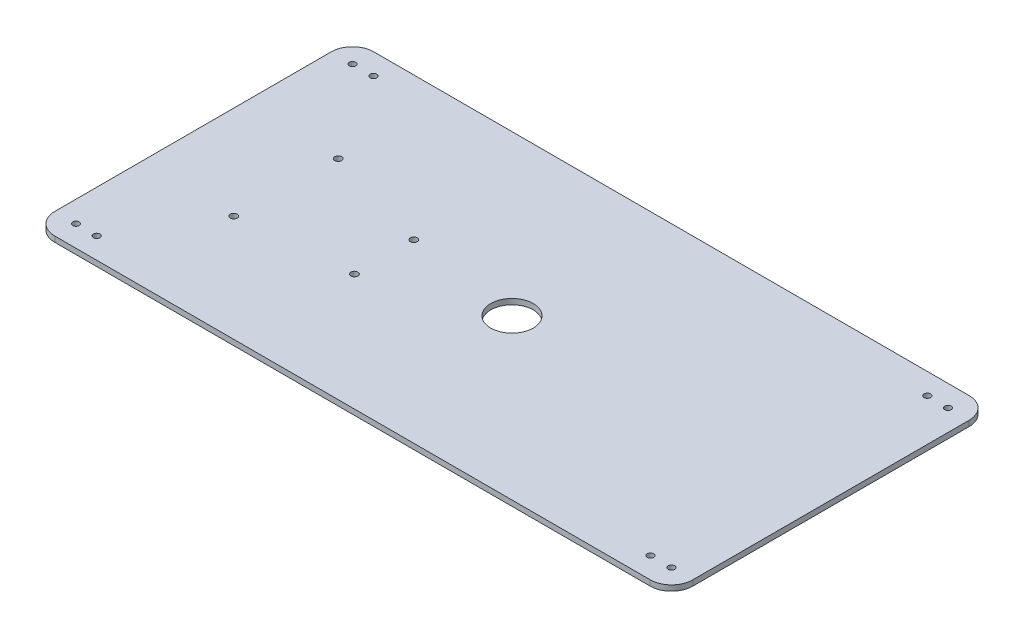
ISO-10303-21;
HEADER;
FILE_DESCRIPTION(('STEP AP214'),'2;1');
FILE_NAME('part.step','',(''),(''),'','','');
FILE_SCHEMA(('AUTOMOTIVE_DESIGN { 1 0 10303 214 1 1 1 1 }'));
ENDSEC;
DATA;
#1=APPLICATION_CONTEXT('core data for automotive mechanical design processes');
#2=APPLICATION_PROTOCOL_DEFINITION('international standard','automotive_design',2000,#1);
#3=PRODUCT_CONTEXT('',#1,'mechanical');
#4=PRODUCT('Part','Part','',(#3));
#5=PRODUCT_RELATED_PRODUCT_CATEGORY('part','',(#4));
#6=PRODUCT_DEFINITION_FORMATION('','',#4);
#7=PRODUCT_DEFINITION_CONTEXT('part definition',#1,'design');
#8=PRODUCT_DEFINITION('design','',#6,#7);
#9=PRODUCT_DEFINITION_SHAPE('','',#8);
#10=(LENGTH_UNIT() NAMED_UNIT(*) SI_UNIT(.MILLI.,.METRE.));
#11=(NAMED_UNIT(*) PLANE_ANGLE_UNIT() SI_UNIT($,.RADIAN.));
#12=(NAMED_UNIT(*) SI_UNIT($,.STERADIAN.) SOLID_ANGLE_UNIT());
#13=UNCERTAINTY_MEASURE_WITH_UNIT(LENGTH_MEASURE(1.E-05),#10,'distance_accuracy_value','');
#14=(GEOMETRIC_REPRESENTATION_CONTEXT(3) GLOBAL_UNCERTAINTY_ASSIGNED_CONTEXT((#13)) GLOBAL_UNIT_ASSIGNED_CONTEXT((#10,
#11,#12)) REPRESENTATION_CONTEXT('',''));
#15=CARTESIAN_POINT('',(0.,0.,0.));
#16=DIRECTION('',(0.,0.,1.));
#17=DIRECTION('',(1.,0.,0.));
#18=AXIS2_PLACEMENT_3D('',#15,#16,#17);
#19=CARTESIAN_POINT('',(0.,2.6,0.));
#20=DIRECTION('',(1.,0.,0.));
#21=DIRECTION('',(0.,0.,-1.));
#22=AXIS2_PLACEMENT_3D('',#19,#20,#21);
#23=PLANE('',#22);
#24=DIRECTION('',(0.,0.,1.));
#25=VECTOR('',#24,1.);
#26=CARTESIAN_POINT('',(0.,2.6,0.));
#27=LINE('',#26,#25);
#28=CARTESIAN_POINT('',(0.,2.6,10.));
#29=VERTEX_POINT('',#28);
#30=CARTESIAN_POINT('',(0.,2.6,140.));
#31=VERTEX_POINT('',#30);
#32=EDGE_CURVE('E121',#29,#31,#27,.T.);
#33=ORIENTED_EDGE('',*,*,#32,.F.);
#34=DIRECTION('',(0.,-1.,0.));
#35=VECTOR('',#34,1.);
#36=CARTESIAN_POINT('',(0.,0.,10.));
#37=LINE('',#36,#35);
#38=CARTESIAN_POINT('',(0.,0.,10.));
#39=VERTEX_POINT('',#38);
#40=EDGE_CURVE('E106',#29,#39,#37,.T.);
#41=ORIENTED_EDGE('',*,*,#40,.T.);
#42=DIRECTION('',(0.,0.,1.));
#43=VECTOR('',#42,1.);
#44=CARTESIAN_POINT('',(0.,0.,0.));
#45=LINE('',#44,#43);
#46=CARTESIAN_POINT('',(0.,0.,140.));
#47=VERTEX_POINT('',#46);
#48=EDGE_CURVE('E118',#39,#47,#45,.T.);
#49=ORIENTED_EDGE('',*,*,#48,.T.);
#50=DIRECTION('',(0.,-1.,0.));
#51=VECTOR('',#50,1.);
#52=CARTESIAN_POINT('',(0.,2.6,140.));
#53=LINE('',#52,#51);
#54=EDGE_CURVE('E123',#47,#31,#53,.F.);
#55=ORIENTED_EDGE('',*,*,#54,.T.);
#56=EDGE_LOOP('',(#33,#41,#49,#55));
#57=FACE_BOUND('',#56,.T.);
#58=ADVANCED_FACE('F35',(#57),#23,.F.);
#59=CARTESIAN_POINT('',(0.,2.6,150.));
#60=DIRECTION('',(0.,0.,-1.));
#61=DIRECTION('',(-1.,0.,0.));
#62=AXIS2_PLACEMENT_3D('',#59,#60,#61);
#63=PLANE('',#62);
#64=DIRECTION('',(1.,0.,0.));
#65=VECTOR('',#64,1.);
#66=CARTESIAN_POINT('',(0.,2.6,150.));
#67=LINE('',#66,#65);
#68=CARTESIAN_POINT('',(10.,2.6,150.));
#69=VERTEX_POINT('',#68);
#70=CARTESIAN_POINT('',(290.,2.6,150.));
#71=VERTEX_POINT('',#70);
#72=EDGE_CURVE('E169',#69,#71,#67,.T.);
#73=ORIENTED_EDGE('',*,*,#72,.F.);
#74=DIRECTION('',(0.,-1.,0.));
#75=VECTOR('',#74,1.);
#76=CARTESIAN_POINT('',(10.,2.6,150.));
#77=LINE('',#76,#75);
#78=CARTESIAN_POINT('',(10.,0.,150.));
#79=VERTEX_POINT('',#78);
#80=EDGE_CURVE('E161',#69,#79,#77,.T.);
#81=ORIENTED_EDGE('',*,*,#80,.T.);
#82=DIRECTION('',(1.,0.,0.));
#83=VECTOR('',#82,1.);
#84=CARTESIAN_POINT('',(0.,0.,150.));
#85=LINE('',#84,#83);
#86=CARTESIAN_POINT('',(290.,0.,150.));
#87=VERTEX_POINT('',#86);
#88=EDGE_CURVE('E127',#79,#87,#85,.T.);
#89=ORIENTED_EDGE('',*,*,#88,.T.);
#90=DIRECTION('',(0.,-1.,0.));
#91=VECTOR('',#90,1.);
#92=CARTESIAN_POINT('',(290.,2.6,150.));
#93=LINE('',#92,#91);
#94=EDGE_CURVE('E159',#87,#71,#93,.F.);
#95=ORIENTED_EDGE('',*,*,#94,.T.);
#96=EDGE_LOOP('',(#73,#81,#89,#95));
#97=FACE_BOUND('',#96,.T.);
#98=ADVANCED_FACE('F167',(#97),#63,.F.);
#99=CARTESIAN_POINT('',(300.,2.6,0.));
#100=DIRECTION('',(1.,0.,0.));
#101=DIRECTION('',(0.,0.,-1.));
#102=AXIS2_PLACEMENT_3D('',#99,#100,#101);
#103=PLANE('',#102);
#104=DIRECTION('',(0.,0.,1.));
#105=VECTOR('',#104,1.);
#106=CARTESIAN_POINT('',(300.,2.6,0.));
#107=LINE('',#106,#105);
#108=CARTESIAN_POINT('',(300.,2.6,10.));
#109=VERTEX_POINT('',#108);
#110=CARTESIAN_POINT('',(300.,2.6,140.));
#111=VERTEX_POINT('',#110);
#112=EDGE_CURVE('E176',#109,#111,#107,.T.);
#113=ORIENTED_EDGE('',*,*,#112,.T.);
#114=DIRECTION('',(0.,-1.,0.));
#115=VECTOR('',#114,1.);
#116=CARTESIAN_POINT('',(300.,0.,140.));
#117=LINE('',#116,#115);
#118=CARTESIAN_POINT('',(300.,0.,140.));
#119=VERTEX_POINT('',#118);
#120=EDGE_CURVE('E11',#111,#119,#117,.T.);
#121=ORIENTED_EDGE('',*,*,#120,.T.);
#122=DIRECTION('',(0.,0.,1.));
#123=VECTOR('',#122,1.);
#124=CARTESIAN_POINT('',(300.,0.,0.));
#125=LINE('',#124,#123);
#126=CARTESIAN_POINT('',(300.,0.,10.));
#127=VERTEX_POINT('',#126);
#128=EDGE_CURVE('E131',#127,#119,#125,.T.);
#129=ORIENTED_EDGE('',*,*,#128,.F.);
#130=DIRECTION('',(0.,-1.,0.));
#131=VECTOR('',#130,1.);
#132=CARTESIAN_POINT('',(300.,2.6,10.));
#133=LINE('',#132,#131);
#134=EDGE_CURVE('E44',#127,#109,#133,.F.);
#135=ORIENTED_EDGE('',*,*,#134,.T.);
#136=EDGE_LOOP('',(#113,#121,#129,#135));
#137=FACE_BOUND('',#136,.T.);
#138=ADVANCED_FACE('F175',(#137),#103,.T.);
#139=CARTESIAN_POINT('',(0.,2.6,0.));
#140=DIRECTION('',(0.,0.,-1.));
#141=DIRECTION('',(-1.,0.,0.));
#142=AXIS2_PLACEMENT_3D('',#139,#140,#141);
#143=PLANE('',#142);
#144=DIRECTION('',(1.,0.,0.));
#145=VECTOR('',#144,1.);
#146=CARTESIAN_POINT('',(0.,0.,0.));
#147=LINE('',#146,#145);
#148=CARTESIAN_POINT('',(10.,0.,0.));
#149=VERTEX_POINT('',#148);
#150=CARTESIAN_POINT('',(290.,0.,0.));
#151=VERTEX_POINT('',#150);
#152=EDGE_CURVE('E142',#149,#151,#147,.T.);
#153=ORIENTED_EDGE('',*,*,#152,.F.);
#154=DIRECTION('',(0.,-1.,0.));
#155=VECTOR('',#154,1.);
#156=CARTESIAN_POINT('',(10.,2.6,0.));
#157=LINE('',#156,#155);
#158=CARTESIAN_POINT('',(10.,2.6,0.));
#159=VERTEX_POINT('',#158);
#160=EDGE_CURVE('E107',#149,#159,#157,.F.);
#161=ORIENTED_EDGE('',*,*,#160,.T.);
#162=DIRECTION('',(1.,0.,0.));
#163=VECTOR('',#162,1.);
#164=CARTESIAN_POINT('',(0.,2.6,0.));
#165=LINE('',#164,#163);
#166=CARTESIAN_POINT('',(290.,2.6,0.));
#167=VERTEX_POINT('',#166);
#168=EDGE_CURVE('E137',#159,#167,#165,.T.);
#169=ORIENTED_EDGE('',*,*,#168,.T.);
#170=DIRECTION('',(0.,-1.,0.));
#171=VECTOR('',#170,1.);
#172=CARTESIAN_POINT('',(290.,2.6,0.));
#173=LINE('',#172,#171);
#174=EDGE_CURVE('E112',#167,#151,#173,.T.);
#175=ORIENTED_EDGE('',*,*,#174,.T.);
#176=EDGE_LOOP('',(#153,#161,#169,#175));
#177=FACE_BOUND('',#176,.T.);
#178=ADVANCED_FACE('F433',(#177),#143,.T.);
#179=CARTESIAN_POINT('',(0.,2.6,0.));
#180=DIRECTION('',(0.,1.,0.));
#181=DIRECTION('',(0.,0.,1.));
#182=AXIS2_PLACEMENT_3D('',#179,#180,#181);
#183=PLANE('',#182);
#184=CARTESIAN_POINT('',(19.812,2.6,140.094));
#185=DIRECTION('',(0.,-1.,0.));
#186=DIRECTION('',(0.,0.,-1.));
#187=AXIS2_PLACEMENT_3D('',#184,#185,#186);
#188=CIRCLE('',#187,1.524);
#189=CARTESIAN_POINT('',(19.812,2.6,138.57));
#190=VERTEX_POINT('',#189);
#191=EDGE_CURVE('E248',#190,#190,#188,.T.);
#192=ORIENTED_EDGE('',*,*,#191,.T.);
#193=EDGE_LOOP('',(#192));
#194=FACE_BOUND('',#193,.T.);
#195=CARTESIAN_POINT('',(280.188,2.6,140.094));
#196=DIRECTION('',(0.,1.,0.));
#197=DIRECTION('',(0.,0.,-1.));
#198=AXIS2_PLACEMENT_3D('',#195,#196,#197);
#199=CIRCLE('',#198,1.524);
#200=CARTESIAN_POINT('',(280.188,2.6,138.57));
#201=VERTEX_POINT('',#200);
#202=EDGE_CURVE('E242',#201,#201,#199,.T.);
#203=ORIENTED_EDGE('',*,*,#202,.F.);
#204=EDGE_LOOP('',(#203));
#205=FACE_BOUND('',#204,.T.);
#206=CARTESIAN_POINT('',(280.188,2.6,9.90599999999998));
#207=DIRECTION('',(0.,-1.,0.));
#208=DIRECTION('',(0.,0.,1.));
#209=AXIS2_PLACEMENT_3D('',#206,#207,#208);
#210=CIRCLE('',#209,1.524);
#211=CARTESIAN_POINT('',(280.188,2.6,11.43));
#212=VERTEX_POINT('',#211);
#213=EDGE_CURVE('E236',#212,#212,#210,.T.);
#214=ORIENTED_EDGE('',*,*,#213,.T.);
#215=EDGE_LOOP('',(#214));
#216=FACE_BOUND('',#215,.T.);
#217=CARTESIAN_POINT('',(19.812,2.6,9.906));
#218=DIRECTION('',(0.,1.,0.));
#219=DIRECTION('',(0.,0.,1.));
#220=AXIS2_PLACEMENT_3D('',#217,#218,#219);
#221=CIRCLE('',#220,1.524);
#222=CARTESIAN_POINT('',(19.812,2.6,11.43));
#223=VERTEX_POINT('',#222);
#224=EDGE_CURVE('E230',#223,#223,#221,.T.);
#225=ORIENTED_EDGE('',*,*,#224,.F.);
#226=EDGE_LOOP('',(#225));
#227=FACE_BOUND('',#226,.T.);
#228=CARTESIAN_POINT('',(150.,2.6,75.));
#229=DIRECTION('',(0.,-1.,0.));
#230=DIRECTION('',(0.,0.,-1.));
#231=AXIS2_PLACEMENT_3D('',#228,#229,#230);
#232=CIRCLE('',#231,10.);
#233=CARTESIAN_POINT('',(150.,2.6,65.));
#234=VERTEX_POINT('',#233);
#235=EDGE_CURVE('E221',#234,#234,#232,.T.);
#236=ORIENTED_EDGE('',*,*,#235,.T.);
#237=EDGE_LOOP('',(#236));
#238=FACE_BOUND('',#237,.T.);
#239=CARTESIAN_POINT('',(95.94475,2.6,95.03875));
#240=DIRECTION('',(0.,1.,0.));
#241=DIRECTION('',(0.,0.,1.));
#242=AXIS2_PLACEMENT_3D('',#239,#240,#241);
#243=CIRCLE('',#242,1.61925);
#244=CARTESIAN_POINT('',(95.94475,2.6,96.658));
#245=VERTEX_POINT('',#244);
#246=EDGE_CURVE('E218',#245,#245,#243,.T.);
#247=ORIENTED_EDGE('',*,*,#246,.F.);
#248=EDGE_LOOP('',(#247));
#249=FACE_BOUND('',#248,.T.);
#250=CARTESIAN_POINT('',(44.01445,2.6,99.78855));
#251=DIRECTION('',(0.,1.,0.));
#252=DIRECTION('',(0.,0.,1.));
#253=AXIS2_PLACEMENT_3D('',#250,#251,#252);
#254=CIRCLE('',#253,1.61925);
#255=CARTESIAN_POINT('',(44.01445,2.6,101.4078));
#256=VERTEX_POINT('',#255);
#257=EDGE_CURVE('E212',#256,#256,#254,.T.);
#258=ORIENTED_EDGE('',*,*,#257,.F.);
#259=EDGE_LOOP('',(#258));
#260=FACE_BOUND('',#259,.T.);
#261=CARTESIAN_POINT('',(95.94475,2.6,67.11145));
#262=DIRECTION('',(0.,1.,0.));
#263=DIRECTION('',(0.,0.,1.));
#264=AXIS2_PLACEMENT_3D('',#261,#262,#263);
#265=CIRCLE('',#264,1.61925);
#266=CARTESIAN_POINT('',(95.94475,2.6,68.7307));
#267=VERTEX_POINT('',#266);
#268=EDGE_CURVE('E206',#267,#267,#265,.T.);
#269=ORIENTED_EDGE('',*,*,#268,.F.);
#270=EDGE_LOOP('',(#269));
#271=FACE_BOUND('',#270,.T.);
#272=CARTESIAN_POINT('',(45.15745,2.6,51.87145));
#273=DIRECTION('',(0.,1.,0.));
#274=DIRECTION('',(0.,0.,1.));
#275=AXIS2_PLACEMENT_3D('',#272,#273,#274);
#276=CIRCLE('',#275,1.61924999999999);
#277=CARTESIAN_POINT('',(45.15745,2.6,53.4907));
#278=VERTEX_POINT('',#277);
#279=EDGE_CURVE('E202',#278,#278,#276,.T.);
#280=ORIENTED_EDGE('',*,*,#279,.F.);
#281=EDGE_LOOP('',(#280));
#282=FACE_BOUND('',#281,.T.);
#283=CARTESIAN_POINT('',(290.,2.6,140.));
#284=DIRECTION('',(0.,1.,0.));
#285=DIRECTION('',(0.,0.,1.));
#286=AXIS2_PLACEMENT_3D('',#283,#284,#285);
#287=CIRCLE('',#286,1.50000000000002);
#288=CARTESIAN_POINT('',(290.,2.6,141.5));
#289=VERTEX_POINT('',#288);
#290=EDGE_CURVE('E194',#289,#289,#287,.T.);
#291=ORIENTED_EDGE('',*,*,#290,.F.);
#292=EDGE_LOOP('',(#291));
#293=FACE_BOUND('',#292,.T.);
#294=CARTESIAN_POINT('',(10.,2.6,140.));
#295=DIRECTION('',(0.,-1.,0.));
#296=DIRECTION('',(0.,0.,1.));
#297=AXIS2_PLACEMENT_3D('',#294,#295,#296);
#298=CIRCLE('',#297,1.50000000000002);
#299=CARTESIAN_POINT('',(10.,2.6,141.5));
#300=VERTEX_POINT('',#299);
#301=EDGE_CURVE('E188',#300,#300,#298,.T.);
#302=ORIENTED_EDGE('',*,*,#301,.T.);
#303=EDGE_LOOP('',(#302));
#304=FACE_BOUND('',#303,.T.);
#305=CARTESIAN_POINT('',(10.,2.6,10.));
#306=DIRECTION('',(0.,1.,0.));
#307=DIRECTION('',(0.,0.,-1.));
#308=AXIS2_PLACEMENT_3D('',#305,#306,#307);
#309=CIRCLE('',#308,1.50000000000002);
#310=CARTESIAN_POINT('',(10.,2.6,8.49999999999999));
#311=VERTEX_POINT('',#310);
#312=EDGE_CURVE('E183',#311,#311,#309,.T.);
#313=ORIENTED_EDGE('',*,*,#312,.F.);
#314=EDGE_LOOP('',(#313));
#315=FACE_BOUND('',#314,.T.);
#316=CARTESIAN_POINT('',(290.,2.6,10.));
#317=DIRECTION('',(0.,-1.,0.));
#318=DIRECTION('',(0.,0.,-1.));
#319=AXIS2_PLACEMENT_3D('',#316,#317,#318);
#320=CIRCLE('',#319,1.50000000000002);
#321=CARTESIAN_POINT('',(290.,2.6,8.49999999999998));
#322=VERTEX_POINT('',#321);
#323=EDGE_CURVE('E128',#322,#322,#320,.T.);
#324=ORIENTED_EDGE('',*,*,#323,.T.);
#325=EDGE_LOOP('',(#324));
#326=FACE_BOUND('',#325,.T.);
#327=ORIENTED_EDGE('',*,*,#168,.F.);
#328=CARTESIAN_POINT('',(10.,2.6,10.));
#329=DIRECTION('',(0.,1.,0.));
#330=DIRECTION('',(0.,0.,1.));
#331=AXIS2_PLACEMENT_3D('',#328,#329,#330);
#332=CIRCLE('',#331,10.);
#333=EDGE_CURVE('E157',#159,#29,#332,.T.);
#334=ORIENTED_EDGE('',*,*,#333,.T.);
#335=ORIENTED_EDGE('',*,*,#32,.T.);
#336=CARTESIAN_POINT('',(10.,2.6,140.));
#337=DIRECTION('',(0.,1.,0.));
#338=DIRECTION('',(0.,0.,1.));
#339=AXIS2_PLACEMENT_3D('',#336,#337,#338);
#340=CIRCLE('',#339,10.);
#341=EDGE_CURVE('E155',#31,#69,#340,.T.);
#342=ORIENTED_EDGE('',*,*,#341,.T.);
#343=ORIENTED_EDGE('',*,*,#72,.T.);
#344=CARTESIAN_POINT('',(290.,2.6,140.));
#345=DIRECTION('',(0.,1.,0.));
#346=DIRECTION('',(0.,0.,1.));
#347=AXIS2_PLACEMENT_3D('',#344,#345,#346);
#348=CIRCLE('',#347,10.);
#349=EDGE_CURVE('E51',#71,#111,#348,.T.);
#350=ORIENTED_EDGE('',*,*,#349,.T.);
#351=ORIENTED_EDGE('',*,*,#112,.F.);
#352=CARTESIAN_POINT('',(290.,2.6,10.));
#353=DIRECTION('',(0.,1.,0.));
#354=DIRECTION('',(0.,0.,1.));
#355=AXIS2_PLACEMENT_3D('',#352,#353,#354);
#356=CIRCLE('',#355,10.);
#357=EDGE_CURVE('E152',#109,#167,#356,.T.);
#358=ORIENTED_EDGE('',*,*,#357,.T.);
#359=EDGE_LOOP('',(#327,#334,#335,#342,#343,#350,#351,#358));
#360=FACE_BOUND('',#359,.T.);
#361=ADVANCED_FACE('F259',(#194,#205,#216,#227,#238,#249,#260,#271,#282,#293,#304,#315,#326,
#360),#183,.T.);
#362=CARTESIAN_POINT('',(0.,0.,0.));
#363=DIRECTION('',(0.,1.,0.));
#364=DIRECTION('',(0.,0.,1.));
#365=AXIS2_PLACEMENT_3D('',#362,#363,#364);
#366=PLANE('',#365);
#367=CARTESIAN_POINT('',(19.812,1.19999999954185E-07,140.094));
#368=DIRECTION('',(0.,-1.,0.));
#369=DIRECTION('',(0.,0.,-1.));
#370=AXIS2_PLACEMENT_3D('',#367,#368,#369);
#371=CIRCLE('',#370,1.524);
#372=CARTESIAN_POINT('',(19.812,1.19999999954185E-07,138.57));
#373=VERTEX_POINT('',#372);
#374=EDGE_CURVE('E245',#373,#373,#371,.T.);
#375=ORIENTED_EDGE('',*,*,#374,.F.);
#376=EDGE_LOOP('',(#375));
#377=FACE_BOUND('',#376,.T.);
#378=CARTESIAN_POINT('',(280.188,1.19999999954185E-07,140.094));
#379=DIRECTION('',(0.,1.,0.));
#380=DIRECTION('',(0.,0.,-1.));
#381=AXIS2_PLACEMENT_3D('',#378,#379,#380);
#382=CIRCLE('',#381,1.524);
#383=CARTESIAN_POINT('',(280.188,1.19999999954185E-07,138.57));
#384=VERTEX_POINT('',#383);
#385=EDGE_CURVE('E239',#384,#384,#382,.T.);
#386=ORIENTED_EDGE('',*,*,#385,.T.);
#387=EDGE_LOOP('',(#386));
#388=FACE_BOUND('',#387,.T.);
#389=CARTESIAN_POINT('',(280.188,1.19999999954185E-07,9.90599999999998));
#390=DIRECTION('',(0.,-1.,0.));
#391=DIRECTION('',(0.,0.,1.));
#392=AXIS2_PLACEMENT_3D('',#389,#390,#391);
#393=CIRCLE('',#392,1.524);
#394=CARTESIAN_POINT('',(280.188,1.19999999954185E-07,11.43));
#395=VERTEX_POINT('',#394);
#396=EDGE_CURVE('E233',#395,#395,#393,.T.);
#397=ORIENTED_EDGE('',*,*,#396,.F.);
#398=EDGE_LOOP('',(#397));
#399=FACE_BOUND('',#398,.T.);
#400=CARTESIAN_POINT('',(19.812,1.19999999954185E-07,9.906));
#401=DIRECTION('',(0.,1.,0.));
#402=DIRECTION('',(0.,0.,1.));
#403=AXIS2_PLACEMENT_3D('',#400,#401,#402);
#404=CIRCLE('',#403,1.524);
#405=CARTESIAN_POINT('',(19.812,1.19999999954185E-07,11.43));
#406=VERTEX_POINT('',#405);
#407=EDGE_CURVE('E227',#406,#406,#404,.T.);
#408=ORIENTED_EDGE('',*,*,#407,.T.);
#409=EDGE_LOOP('',(#408));
#410=FACE_BOUND('',#409,.T.);
#411=CARTESIAN_POINT('',(150.,0.,75.));
#412=DIRECTION('',(0.,-1.,0.));
#413=DIRECTION('',(0.,0.,-1.));
#414=AXIS2_PLACEMENT_3D('',#411,#412,#413);
#415=CIRCLE('',#414,10.);
#416=CARTESIAN_POINT('',(150.,0.,65.));
#417=VERTEX_POINT('',#416);
#418=EDGE_CURVE('E224',#417,#417,#415,.T.);
#419=ORIENTED_EDGE('',*,*,#418,.F.);
#420=EDGE_LOOP('',(#419));
#421=FACE_BOUND('',#420,.T.);
#422=CARTESIAN_POINT('',(95.94475,0.,95.03875));
#423=DIRECTION('',(0.,1.,0.));
#424=DIRECTION('',(0.,0.,1.));
#425=AXIS2_PLACEMENT_3D('',#422,#423,#424);
#426=CIRCLE('',#425,1.61925);
#427=CARTESIAN_POINT('',(95.94475,0.,96.658));
#428=VERTEX_POINT('',#427);
#429=EDGE_CURVE('E215',#428,#428,#426,.T.);
#430=ORIENTED_EDGE('',*,*,#429,.T.);
#431=EDGE_LOOP('',(#430));
#432=FACE_BOUND('',#431,.T.);
#433=CARTESIAN_POINT('',(44.01445,0.,99.78855));
#434=DIRECTION('',(0.,1.,0.));
#435=DIRECTION('',(0.,0.,1.));
#436=AXIS2_PLACEMENT_3D('',#433,#434,#435);
#437=CIRCLE('',#436,1.61925);
#438=CARTESIAN_POINT('',(44.01445,0.,101.4078));
#439=VERTEX_POINT('',#438);
#440=EDGE_CURVE('E209',#439,#439,#437,.T.);
#441=ORIENTED_EDGE('',*,*,#440,.T.);
#442=EDGE_LOOP('',(#441));
#443=FACE_BOUND('',#442,.T.);
#444=CARTESIAN_POINT('',(95.94475,0.,67.11145));
#445=DIRECTION('',(0.,1.,0.));
#446=DIRECTION('',(0.,0.,1.));
#447=AXIS2_PLACEMENT_3D('',#444,#445,#446);
#448=CIRCLE('',#447,1.61925);
#449=CARTESIAN_POINT('',(95.94475,0.,68.7307));
#450=VERTEX_POINT('',#449);
#451=EDGE_CURVE('E205',#450,#450,#448,.T.);
#452=ORIENTED_EDGE('',*,*,#451,.T.);
#453=EDGE_LOOP('',(#452));
#454=FACE_BOUND('',#453,.T.);
#455=CARTESIAN_POINT('',(45.15745,0.,51.87145));
#456=DIRECTION('',(0.,1.,0.));
#457=DIRECTION('',(0.,0.,1.));
#458=AXIS2_PLACEMENT_3D('',#455,#456,#457);
#459=CIRCLE('',#458,1.61924999999999);
#460=CARTESIAN_POINT('',(45.15745,0.,53.4907));
#461=VERTEX_POINT('',#460);
#462=EDGE_CURVE('E39',#461,#461,#459,.T.);
#463=ORIENTED_EDGE('',*,*,#462,.T.);
#464=EDGE_LOOP('',(#463));
#465=FACE_BOUND('',#464,.T.);
#466=CARTESIAN_POINT('',(290.,0.,140.));
#467=DIRECTION('',(0.,1.,0.));
#468=DIRECTION('',(0.,0.,1.));
#469=AXIS2_PLACEMENT_3D('',#466,#467,#468);
#470=CIRCLE('',#469,1.50000000000002);
#471=CARTESIAN_POINT('',(290.,0.,141.5));
#472=VERTEX_POINT('',#471);
#473=EDGE_CURVE('E197',#472,#472,#470,.T.);
#474=ORIENTED_EDGE('',*,*,#473,.T.);
#475=EDGE_LOOP('',(#474));
#476=FACE_BOUND('',#475,.T.);
#477=CARTESIAN_POINT('',(10.,0.,140.));
#478=DIRECTION('',(0.,-1.,0.));
#479=DIRECTION('',(0.,0.,1.));
#480=AXIS2_PLACEMENT_3D('',#477,#478,#479);
#481=CIRCLE('',#480,1.50000000000002);
#482=CARTESIAN_POINT('',(10.,0.,141.5));
#483=VERTEX_POINT('',#482);
#484=EDGE_CURVE('E191',#483,#483,#481,.T.);
#485=ORIENTED_EDGE('',*,*,#484,.F.);
#486=EDGE_LOOP('',(#485));
#487=FACE_BOUND('',#486,.T.);
#488=CARTESIAN_POINT('',(10.,0.,10.));
#489=DIRECTION('',(0.,1.,0.));
#490=DIRECTION('',(0.,0.,-1.));
#491=AXIS2_PLACEMENT_3D('',#488,#489,#490);
#492=CIRCLE('',#491,1.50000000000002);
#493=CARTESIAN_POINT('',(10.,0.,8.49999999999999));
#494=VERTEX_POINT('',#493);
#495=EDGE_CURVE('E185',#494,#494,#492,.T.);
#496=ORIENTED_EDGE('',*,*,#495,.T.);
#497=EDGE_LOOP('',(#496));
#498=FACE_BOUND('',#497,.T.);
#499=CARTESIAN_POINT('',(290.,0.,10.));
#500=DIRECTION('',(0.,-1.,0.));
#501=DIRECTION('',(0.,0.,-1.));
#502=AXIS2_PLACEMENT_3D('',#499,#500,#501);
#503=CIRCLE('',#502,1.50000000000002);
#504=CARTESIAN_POINT('',(290.,0.,8.49999999999998));
#505=VERTEX_POINT('',#504);
#506=EDGE_CURVE('E134',#505,#505,#503,.T.);
#507=ORIENTED_EDGE('',*,*,#506,.F.);
#508=EDGE_LOOP('',(#507));
#509=FACE_BOUND('',#508,.T.);
#510=ORIENTED_EDGE('',*,*,#48,.F.);
#511=CARTESIAN_POINT('',(10.,0.,10.));
#512=DIRECTION('',(0.,1.,0.));
#513=DIRECTION('',(0.,0.,1.));
#514=AXIS2_PLACEMENT_3D('',#511,#512,#513);
#515=CIRCLE('',#514,10.);
#516=EDGE_CURVE('E102',#39,#149,#515,.F.);
#517=ORIENTED_EDGE('',*,*,#516,.T.);
#518=ORIENTED_EDGE('',*,*,#152,.T.);
#519=CARTESIAN_POINT('',(290.,0.,10.));
#520=DIRECTION('',(0.,1.,0.));
#521=DIRECTION('',(0.,0.,1.));
#522=AXIS2_PLACEMENT_3D('',#519,#520,#521);
#523=CIRCLE('',#522,10.);
#524=EDGE_CURVE('E122',#151,#127,#523,.F.);
#525=ORIENTED_EDGE('',*,*,#524,.T.);
#526=ORIENTED_EDGE('',*,*,#128,.T.);
#527=CARTESIAN_POINT('',(290.,0.,140.));
#528=DIRECTION('',(0.,1.,0.));
#529=DIRECTION('',(0.,0.,1.));
#530=AXIS2_PLACEMENT_3D('',#527,#528,#529);
#531=CIRCLE('',#530,10.);
#532=EDGE_CURVE('E146',#119,#87,#531,.F.);
#533=ORIENTED_EDGE('',*,*,#532,.T.);
#534=ORIENTED_EDGE('',*,*,#88,.F.);
#535=CARTESIAN_POINT('',(10.,0.,140.));
#536=DIRECTION('',(0.,1.,0.));
#537=DIRECTION('',(0.,0.,1.));
#538=AXIS2_PLACEMENT_3D('',#535,#536,#537);
#539=CIRCLE('',#538,10.);
#540=EDGE_CURVE('E113',#79,#47,#539,.F.);
#541=ORIENTED_EDGE('',*,*,#540,.T.);
#542=EDGE_LOOP('',(#510,#517,#518,#525,#526,#533,#534,#541));
#543=FACE_BOUND('',#542,.T.);
#544=ADVANCED_FACE('F125',(#377,#388,#399,#410,#421,#432,#443,#454,#465,#476,#487,#498,#509,
#543),#366,.F.);
#545=CARTESIAN_POINT('',(10.,2.6,10.));
#546=DIRECTION('',(0.,1.,0.));
#547=DIRECTION('',(0.,0.,1.));
#548=AXIS2_PLACEMENT_3D('',#545,#546,#547);
#549=CYLINDRICAL_SURFACE('',#548,10.);
#550=ORIENTED_EDGE('',*,*,#333,.F.);
#551=ORIENTED_EDGE('',*,*,#160,.F.);
#552=ORIENTED_EDGE('',*,*,#516,.F.);
#553=ORIENTED_EDGE('',*,*,#40,.F.);
#554=EDGE_LOOP('',(#550,#551,#552,#553));
#555=FACE_BOUND('',#554,.T.);
#556=ADVANCED_FACE('F105',(#555),#549,.T.);
#557=CARTESIAN_POINT('',(10.,2.6,140.));
#558=DIRECTION('',(0.,-1.,0.));
#559=DIRECTION('',(0.,0.,-1.));
#560=AXIS2_PLACEMENT_3D('',#557,#558,#559);
#561=CYLINDRICAL_SURFACE('',#560,10.);
#562=ORIENTED_EDGE('',*,*,#341,.F.);
#563=ORIENTED_EDGE('',*,*,#54,.F.);
#564=ORIENTED_EDGE('',*,*,#540,.F.);
#565=ORIENTED_EDGE('',*,*,#80,.F.);
#566=EDGE_LOOP('',(#562,#563,#564,#565));
#567=FACE_BOUND('',#566,.T.);
#568=ADVANCED_FACE('F311',(#567),#561,.T.);
#569=CARTESIAN_POINT('',(290.,2.6,140.));
#570=DIRECTION('',(0.,1.,0.));
#571=DIRECTION('',(0.,0.,1.));
#572=AXIS2_PLACEMENT_3D('',#569,#570,#571);
#573=CYLINDRICAL_SURFACE('',#572,10.);
#574=ORIENTED_EDGE('',*,*,#349,.F.);
#575=ORIENTED_EDGE('',*,*,#94,.F.);
#576=ORIENTED_EDGE('',*,*,#532,.F.);
#577=ORIENTED_EDGE('',*,*,#120,.F.);
#578=EDGE_LOOP('',(#574,#575,#576,#577));
#579=FACE_BOUND('',#578,.T.);
#580=ADVANCED_FACE('F174',(#579),#573,.T.);
#581=CARTESIAN_POINT('',(290.,2.6,10.));
#582=DIRECTION('',(0.,-1.,0.));
#583=DIRECTION('',(0.,0.,-1.));
#584=AXIS2_PLACEMENT_3D('',#581,#582,#583);
#585=CYLINDRICAL_SURFACE('',#584,10.);
#586=ORIENTED_EDGE('',*,*,#357,.F.);
#587=ORIENTED_EDGE('',*,*,#134,.F.);
#588=ORIENTED_EDGE('',*,*,#524,.F.);
#589=ORIENTED_EDGE('',*,*,#174,.F.);
#590=EDGE_LOOP('',(#586,#587,#588,#589));
#591=FACE_BOUND('',#590,.T.);
#592=ADVANCED_FACE('F37',(#591),#585,.T.);
#593=CARTESIAN_POINT('',(290.,2.6,10.));
#594=DIRECTION('',(0.,-1.,0.));
#595=DIRECTION('',(0.,0.,-1.));
#596=AXIS2_PLACEMENT_3D('',#593,#594,#595);
#597=CYLINDRICAL_SURFACE('',#596,1.50000000000002);
#598=ORIENTED_EDGE('',*,*,#323,.F.);
#599=EDGE_LOOP('',(#598));
#600=FACE_BOUND('',#599,.T.);
#601=ORIENTED_EDGE('',*,*,#506,.T.);
#602=EDGE_LOOP('',(#601));
#603=FACE_BOUND('',#602,.T.);
#604=ADVANCED_FACE('F286',(#600,#603),#597,.F.);
#605=CARTESIAN_POINT('',(10.,2.6,10.));
#606=DIRECTION('',(0.,-1.,0.));
#607=DIRECTION('',(0.,0.,-1.));
#608=AXIS2_PLACEMENT_3D('',#605,#606,#607);
#609=CYLINDRICAL_SURFACE('',#608,1.50000000000002);
#610=ORIENTED_EDGE('',*,*,#312,.T.);
#611=EDGE_LOOP('',(#610));
#612=FACE_BOUND('',#611,.T.);
#613=ORIENTED_EDGE('',*,*,#495,.F.);
#614=EDGE_LOOP('',(#613));
#615=FACE_BOUND('',#614,.T.);
#616=ADVANCED_FACE('F288',(#612,#615),#609,.F.);
#617=CARTESIAN_POINT('',(10.,2.6,140.));
#618=DIRECTION('',(0.,-1.,0.));
#619=DIRECTION('',(0.,0.,-1.));
#620=AXIS2_PLACEMENT_3D('',#617,#618,#619);
#621=CYLINDRICAL_SURFACE('',#620,1.50000000000002);
#622=ORIENTED_EDGE('',*,*,#301,.F.);
#623=EDGE_LOOP('',(#622));
#624=FACE_BOUND('',#623,.T.);
#625=ORIENTED_EDGE('',*,*,#484,.T.);
#626=EDGE_LOOP('',(#625));
#627=FACE_BOUND('',#626,.T.);
#628=ADVANCED_FACE('F295',(#624,#627),#621,.F.);
#629=CARTESIAN_POINT('',(290.,2.6,140.));
#630=DIRECTION('',(0.,-1.,0.));
#631=DIRECTION('',(0.,0.,-1.));
#632=AXIS2_PLACEMENT_3D('',#629,#630,#631);
#633=CYLINDRICAL_SURFACE('',#632,1.50000000000002);
#634=ORIENTED_EDGE('',*,*,#290,.T.);
#635=EDGE_LOOP('',(#634));
#636=FACE_BOUND('',#635,.T.);
#637=ORIENTED_EDGE('',*,*,#473,.F.);
#638=EDGE_LOOP('',(#637));
#639=FACE_BOUND('',#638,.T.);
#640=ADVANCED_FACE('F341',(#636,#639),#633,.F.);
#641=CARTESIAN_POINT('',(45.15745,-7.4,51.87145));
#642=DIRECTION('',(0.,1.,0.));
#643=DIRECTION('',(0.,0.,1.));
#644=AXIS2_PLACEMENT_3D('',#641,#642,#643);
#645=CYLINDRICAL_SURFACE('',#644,1.61924999999999);
#646=ORIENTED_EDGE('',*,*,#279,.T.);
#647=EDGE_LOOP('',(#646));
#648=FACE_BOUND('',#647,.T.);
#649=ORIENTED_EDGE('',*,*,#462,.F.);
#650=EDGE_LOOP('',(#649));
#651=FACE_BOUND('',#650,.T.);
#652=ADVANCED_FACE('F351',(#648,#651),#645,.F.);
#653=CARTESIAN_POINT('',(95.94475,0.,67.11145));
#654=DIRECTION('',(0.,1.,0.));
#655=DIRECTION('',(0.,0.,1.));
#656=AXIS2_PLACEMENT_3D('',#653,#654,#655);
#657=CYLINDRICAL_SURFACE('',#656,1.61925);
#658=ORIENTED_EDGE('',*,*,#451,.F.);
#659=EDGE_LOOP('',(#658));
#660=FACE_BOUND('',#659,.T.);
#661=ORIENTED_EDGE('',*,*,#268,.T.);
#662=EDGE_LOOP('',(#661));
#663=FACE_BOUND('',#662,.T.);
#664=ADVANCED_FACE('F361',(#660,#663),#657,.F.);
#665=CARTESIAN_POINT('',(44.01445,0.,99.78855));
#666=DIRECTION('',(0.,1.,0.));
#667=DIRECTION('',(0.,0.,1.));
#668=AXIS2_PLACEMENT_3D('',#665,#666,#667);
#669=CYLINDRICAL_SURFACE('',#668,1.61925);
#670=ORIENTED_EDGE('',*,*,#440,.F.);
#671=EDGE_LOOP('',(#670));
#672=FACE_BOUND('',#671,.T.);
#673=ORIENTED_EDGE('',*,*,#257,.T.);
#674=EDGE_LOOP('',(#673));
#675=FACE_BOUND('',#674,.T.);
#676=ADVANCED_FACE('F371',(#672,#675),#669,.F.);
#677=CARTESIAN_POINT('',(95.94475,0.,95.03875));
#678=DIRECTION('',(0.,1.,0.));
#679=DIRECTION('',(0.,0.,1.));
#680=AXIS2_PLACEMENT_3D('',#677,#678,#679);
#681=CYLINDRICAL_SURFACE('',#680,1.61925);
#682=ORIENTED_EDGE('',*,*,#429,.F.);
#683=EDGE_LOOP('',(#682));
#684=FACE_BOUND('',#683,.T.);
#685=ORIENTED_EDGE('',*,*,#246,.T.);
#686=EDGE_LOOP('',(#685));
#687=FACE_BOUND('',#686,.T.);
#688=ADVANCED_FACE('F381',(#684,#687),#681,.F.);
#689=CARTESIAN_POINT('',(150.,2.6,75.));
#690=DIRECTION('',(0.,-1.,0.));
#691=DIRECTION('',(0.,0.,-1.));
#692=AXIS2_PLACEMENT_3D('',#689,#690,#691);
#693=CYLINDRICAL_SURFACE('',#692,10.);
#694=ORIENTED_EDGE('',*,*,#235,.F.);
#695=EDGE_LOOP('',(#694));
#696=FACE_BOUND('',#695,.T.);
#697=ORIENTED_EDGE('',*,*,#418,.T.);
#698=EDGE_LOOP('',(#697));
#699=FACE_BOUND('',#698,.T.);
#700=ADVANCED_FACE('F391',(#696,#699),#693,.F.);
#701=CARTESIAN_POINT('',(19.812,1.19999999954185E-07,9.906));
#702=DIRECTION('',(0.,1.,0.));
#703=DIRECTION('',(0.,0.,1.));
#704=AXIS2_PLACEMENT_3D('',#701,#702,#703);
#705=CYLINDRICAL_SURFACE('',#704,1.524);
#706=ORIENTED_EDGE('',*,*,#407,.F.);
#707=EDGE_LOOP('',(#706));
#708=FACE_BOUND('',#707,.T.);
#709=ORIENTED_EDGE('',*,*,#224,.T.);
#710=EDGE_LOOP('',(#709));
#711=FACE_BOUND('',#710,.T.);
#712=ADVANCED_FACE('F401',(#708,#711),#705,.F.);
#713=CARTESIAN_POINT('',(280.188,1.19999999954185E-07,9.90599999999998));
#714=DIRECTION('',(0.,1.,0.));
#715=DIRECTION('',(0.,0.,1.));
#716=AXIS2_PLACEMENT_3D('',#713,#714,#715);
#717=CYLINDRICAL_SURFACE('',#716,1.524);
#718=ORIENTED_EDGE('',*,*,#396,.T.);
#719=EDGE_LOOP('',(#718));
#720=FACE_BOUND('',#719,.T.);
#721=ORIENTED_EDGE('',*,*,#213,.F.);
#722=EDGE_LOOP('',(#721));
#723=FACE_BOUND('',#722,.T.);
#724=ADVANCED_FACE('F411',(#720,#723),#717,.F.);
#725=CARTESIAN_POINT('',(280.188,1.19999999954185E-07,140.094));
#726=DIRECTION('',(0.,1.,0.));
#727=DIRECTION('',(0.,0.,1.));
#728=AXIS2_PLACEMENT_3D('',#725,#726,#727);
#729=CYLINDRICAL_SURFACE('',#728,1.524);
#730=ORIENTED_EDGE('',*,*,#385,.F.);
#731=EDGE_LOOP('',(#730));
#732=FACE_BOUND('',#731,.T.);
#733=ORIENTED_EDGE('',*,*,#202,.T.);
#734=EDGE_LOOP('',(#733));
#735=FACE_BOUND('',#734,.T.);
#736=ADVANCED_FACE('F421',(#732,#735),#729,.F.);
#737=CARTESIAN_POINT('',(19.812,1.19999999954185E-07,140.094));
#738=DIRECTION('',(0.,1.,0.));
#739=DIRECTION('',(0.,0.,1.));
#740=AXIS2_PLACEMENT_3D('',#737,#738,#739);
#741=CYLINDRICAL_SURFACE('',#740,1.524);
#742=ORIENTED_EDGE('',*,*,#374,.T.);
#743=EDGE_LOOP('',(#742));
#744=FACE_BOUND('',#743,.T.);
#745=ORIENTED_EDGE('',*,*,#191,.F.);
#746=EDGE_LOOP('',(#745));
#747=FACE_BOUND('',#746,.T.);
#748=ADVANCED_FACE('F254',(#744,#747),#741,.F.);
#749=CLOSED_SHELL('',(#58,#98,#138,#178,#361,#544,#556,#568,#580,#592,#604,#616,#628,#640,#652,
#664,#676,#688,#700,#712,#724,#736,#748));
#750=MANIFOLD_SOLID_BREP('B2',#749);
#751=ADVANCED_BREP_SHAPE_REPRESENTATION('',(#18,#750),#14);
#752=SHAPE_DEFINITION_REPRESENTATION(#9,#751);
ENDSEC;
END-ISO-10303-21;
